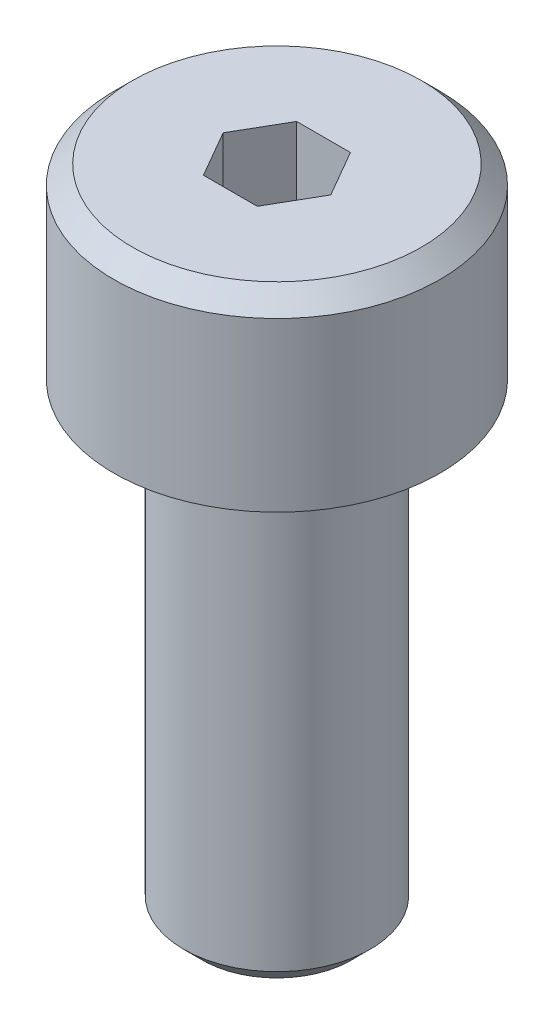
ISO-10303-21;
HEADER;
FILE_DESCRIPTION(('STEP AP214'),'2;1');
FILE_NAME('part.step','',(''),(''),'','','');
FILE_SCHEMA(('AUTOMOTIVE_DESIGN { 1 0 10303 214 1 1 1 1 }'));
ENDSEC;
DATA;
#1=APPLICATION_CONTEXT('core data for automotive mechanical design processes');
#2=APPLICATION_PROTOCOL_DEFINITION('international standard','automotive_design',2000,#1);
#3=PRODUCT_CONTEXT('',#1,'mechanical');
#4=PRODUCT('Part','Part','',(#3));
#5=PRODUCT_RELATED_PRODUCT_CATEGORY('part','',(#4));
#6=PRODUCT_DEFINITION_FORMATION('','',#4);
#7=PRODUCT_DEFINITION_CONTEXT('part definition',#1,'design');
#8=PRODUCT_DEFINITION('design','',#6,#7);
#9=PRODUCT_DEFINITION_SHAPE('','',#8);
#10=(LENGTH_UNIT() NAMED_UNIT(*) SI_UNIT(.MILLI.,.METRE.));
#11=(NAMED_UNIT(*) PLANE_ANGLE_UNIT() SI_UNIT($,.RADIAN.));
#12=(NAMED_UNIT(*) SI_UNIT($,.STERADIAN.) SOLID_ANGLE_UNIT());
#13=UNCERTAINTY_MEASURE_WITH_UNIT(LENGTH_MEASURE(1.E-05),#10,'distance_accuracy_value','');
#14=(GEOMETRIC_REPRESENTATION_CONTEXT(3) GLOBAL_UNCERTAINTY_ASSIGNED_CONTEXT((#13)) GLOBAL_UNIT_ASSIGNED_CONTEXT((#10,
#11,#12)) REPRESENTATION_CONTEXT('',''));
#15=CARTESIAN_POINT('',(0.,0.,0.));
#16=DIRECTION('',(0.,0.,1.));
#17=DIRECTION('',(1.,0.,0.));
#18=AXIS2_PLACEMENT_3D('',#15,#16,#17);
#19=CARTESIAN_POINT('',(0.,14.,0.));
#20=DIRECTION('',(0.,1.,0.));
#21=DIRECTION('',(0.,0.,1.));
#22=AXIS2_PLACEMENT_3D('',#19,#20,#21);
#23=PLANE('',#22);
#24=DIRECTION('',(0.499999999999999,0.,-0.866025403784439));
#25=VECTOR('',#24,1.);
#26=CARTESIAN_POINT('',(0.577350269189626,14.,1.));
#27=LINE('',#26,#25);
#28=CARTESIAN_POINT('',(0.577350269189626,14.,1.));
#29=VERTEX_POINT('',#28);
#30=CARTESIAN_POINT('',(1.15470053837925,14.,0.));
#31=VERTEX_POINT('',#30);
#32=EDGE_CURVE('E54',#29,#31,#27,.T.);
#33=ORIENTED_EDGE('',*,*,#32,.F.);
#34=DIRECTION('',(1.,0.,0.));
#35=VECTOR('',#34,1.);
#36=CARTESIAN_POINT('',(-0.577350269189626,14.,1.));
#37=LINE('',#36,#35);
#38=CARTESIAN_POINT('',(-0.577350269189626,14.,1.));
#39=VERTEX_POINT('',#38);
#40=EDGE_CURVE('E147',#39,#29,#37,.T.);
#41=ORIENTED_EDGE('',*,*,#40,.F.);
#42=DIRECTION('',(0.5,0.,0.866025403784439));
#43=VECTOR('',#42,1.);
#44=CARTESIAN_POINT('',(-1.15470053837925,14.,0.));
#45=LINE('',#44,#43);
#46=CARTESIAN_POINT('',(-1.15470053837925,14.,0.));
#47=VERTEX_POINT('',#46);
#48=EDGE_CURVE('E144',#47,#39,#45,.T.);
#49=ORIENTED_EDGE('',*,*,#48,.F.);
#50=DIRECTION('',(-0.5,0.,0.866025403784439));
#51=VECTOR('',#50,1.);
#52=CARTESIAN_POINT('',(-0.577350269189626,14.,-1.));
#53=LINE('',#52,#51);
#54=CARTESIAN_POINT('',(-0.577350269189626,14.,-1.));
#55=VERTEX_POINT('',#54);
#56=EDGE_CURVE('E102',#55,#47,#53,.T.);
#57=ORIENTED_EDGE('',*,*,#56,.F.);
#58=DIRECTION('',(-1.,0.,0.));
#59=VECTOR('',#58,1.);
#60=CARTESIAN_POINT('',(0.577350269189625,14.,-1.));
#61=LINE('',#60,#59);
#62=CARTESIAN_POINT('',(0.577350269189625,14.,-1.));
#63=VERTEX_POINT('',#62);
#64=EDGE_CURVE('E138',#63,#55,#61,.T.);
#65=ORIENTED_EDGE('',*,*,#64,.F.);
#66=DIRECTION('',(-0.5,0.,-0.866025403784438));
#67=VECTOR('',#66,1.);
#68=CARTESIAN_POINT('',(1.15470053837925,14.,0.));
#69=LINE('',#68,#67);
#70=EDGE_CURVE('E134',#31,#63,#69,.T.);
#71=ORIENTED_EDGE('',*,*,#70,.F.);
#72=EDGE_LOOP('',(#33,#41,#49,#57,#65,#71));
#73=FACE_BOUND('',#72,.T.);
#74=CARTESIAN_POINT('',(0.,14.,0.));
#75=DIRECTION('',(0.,1.,0.));
#76=DIRECTION('',(0.,0.,1.));
#77=AXIS2_PLACEMENT_3D('',#74,#75,#76);
#78=CIRCLE('',#77,3.1);
#79=CARTESIAN_POINT('',(0.,14.,-3.1));
#80=VERTEX_POINT('',#79);
#81=EDGE_CURVE('E174',#80,#80,#78,.T.);
#82=ORIENTED_EDGE('',*,*,#81,.T.);
#83=EDGE_LOOP('',(#82));
#84=FACE_BOUND('',#83,.T.);
#85=ADVANCED_FACE('F38',(#73,#84),#23,.T.);
#86=CARTESIAN_POINT('',(0.,0.,0.));
#87=DIRECTION('',(0.,-1.,0.));
#88=DIRECTION('',(0.,0.,-1.));
#89=AXIS2_PLACEMENT_3D('',#86,#87,#88);
#90=CYLINDRICAL_SURFACE('',#89,3.5);
#91=CARTESIAN_POINT('',(0.,13.6,0.));
#92=DIRECTION('',(0.,1.,0.));
#93=DIRECTION('',(0.,0.,1.));
#94=AXIS2_PLACEMENT_3D('',#91,#92,#93);
#95=CIRCLE('',#94,3.5);
#96=CARTESIAN_POINT('',(0.,13.6,-3.5));
#97=VERTEX_POINT('',#96);
#98=EDGE_CURVE('E170',#97,#97,#95,.F.);
#99=ORIENTED_EDGE('',*,*,#98,.T.);
#100=EDGE_LOOP('',(#99));
#101=FACE_BOUND('',#100,.T.);
#102=CARTESIAN_POINT('',(0.,10.,0.));
#103=DIRECTION('',(0.,-1.,0.));
#104=DIRECTION('',(0.,0.,-1.));
#105=AXIS2_PLACEMENT_3D('',#102,#103,#104);
#106=CIRCLE('',#105,3.5);
#107=CARTESIAN_POINT('',(0.,10.,-3.5));
#108=VERTEX_POINT('',#107);
#109=EDGE_CURVE('E166',#108,#108,#106,.T.);
#110=ORIENTED_EDGE('',*,*,#109,.F.);
#111=EDGE_LOOP('',(#110));
#112=FACE_BOUND('',#111,.T.);
#113=ADVANCED_FACE('F196',(#101,#112),#90,.T.);
#114=CARTESIAN_POINT('',(3.5,10.,0.));
#115=DIRECTION('',(0.,-1.,0.));
#116=DIRECTION('',(0.,0.,-1.));
#117=AXIS2_PLACEMENT_3D('',#114,#115,#116);
#118=PLANE('',#117);
#119=ORIENTED_EDGE('',*,*,#109,.T.);
#120=EDGE_LOOP('',(#119));
#121=FACE_BOUND('',#120,.T.);
#122=CARTESIAN_POINT('',(0.,10.,0.));
#123=DIRECTION('',(0.,-1.,0.));
#124=DIRECTION('',(0.,0.,-1.));
#125=AXIS2_PLACEMENT_3D('',#122,#123,#124);
#126=CIRCLE('',#125,2.);
#127=CARTESIAN_POINT('',(0.,10.,-2.));
#128=VERTEX_POINT('',#127);
#129=EDGE_CURVE('E153',#128,#128,#126,.T.);
#130=ORIENTED_EDGE('',*,*,#129,.F.);
#131=EDGE_LOOP('',(#130));
#132=FACE_BOUND('',#131,.T.);
#133=ADVANCED_FACE('F202',(#121,#132),#118,.T.);
#134=CARTESIAN_POINT('',(0.,0.,0.));
#135=DIRECTION('',(0.,-1.,0.));
#136=DIRECTION('',(0.,0.,-1.));
#137=AXIS2_PLACEMENT_3D('',#134,#135,#136);
#138=CYLINDRICAL_SURFACE('',#137,2.);
#139=CARTESIAN_POINT('',(0.,0.400000000000003,0.));
#140=DIRECTION('',(0.,-1.,0.));
#141=DIRECTION('',(0.,0.,-1.));
#142=AXIS2_PLACEMENT_3D('',#139,#140,#141);
#143=CIRCLE('',#142,2.);
#144=CARTESIAN_POINT('',(0.,0.400000000000003,-2.));
#145=VERTEX_POINT('',#144);
#146=EDGE_CURVE('E11',#145,#145,#143,.F.);
#147=ORIENTED_EDGE('',*,*,#146,.T.);
#148=EDGE_LOOP('',(#147));
#149=FACE_BOUND('',#148,.T.);
#150=ORIENTED_EDGE('',*,*,#129,.T.);
#151=EDGE_LOOP('',(#150));
#152=FACE_BOUND('',#151,.T.);
#153=ADVANCED_FACE('F209',(#149,#152),#138,.T.);
#154=CARTESIAN_POINT('',(2.,0.,0.));
#155=DIRECTION('',(0.,-1.,0.));
#156=DIRECTION('',(0.,0.,-1.));
#157=AXIS2_PLACEMENT_3D('',#154,#155,#156);
#158=PLANE('',#157);
#159=CARTESIAN_POINT('',(0.,0.,0.));
#160=DIRECTION('',(0.,-1.,0.));
#161=DIRECTION('',(0.,0.,-1.));
#162=AXIS2_PLACEMENT_3D('',#159,#160,#161);
#163=CIRCLE('',#162,1.6);
#164=CARTESIAN_POINT('',(0.,0.,-1.6));
#165=VERTEX_POINT('',#164);
#166=EDGE_CURVE('E47',#165,#165,#163,.T.);
#167=ORIENTED_EDGE('',*,*,#166,.T.);
#168=EDGE_LOOP('',(#167));
#169=FACE_BOUND('',#168,.T.);
#170=ADVANCED_FACE('F181',(#169),#158,.T.);
#171=CARTESIAN_POINT('',(0.,13.6,0.));
#172=DIRECTION('',(0.,-1.,0.));
#173=DIRECTION('',(0.,0.,-1.));
#174=AXIS2_PLACEMENT_3D('',#171,#172,#173);
#175=CONICAL_SURFACE('',#174,3.5,0.785398163397449);
#176=CARTESIAN_POINT('',(0.,14.,-3.1));
#177=CARTESIAN_POINT('',(0.,13.9958333333333,-3.10416666666667));
#178=CARTESIAN_POINT('',(0.,13.9916666666667,-3.10833333333333));
#179=CARTESIAN_POINT('',(0.,13.9833333333333,-3.11666666666667));
#180=CARTESIAN_POINT('',(0.,13.9791666666667,-3.12083333333333));
#181=CARTESIAN_POINT('',(0.,13.9708333333333,-3.12916666666667));
#182=CARTESIAN_POINT('',(0.,13.9666666666667,-3.13333333333333));
#183=CARTESIAN_POINT('',(0.,13.9583333333333,-3.14166666666667));
#184=CARTESIAN_POINT('',(0.,13.9541666666667,-3.14583333333333));
#185=CARTESIAN_POINT('',(0.,13.9458333333333,-3.15416666666667));
#186=CARTESIAN_POINT('',(0.,13.9416666666667,-3.15833333333333));
#187=CARTESIAN_POINT('',(0.,13.9333333333333,-3.16666666666667));
#188=CARTESIAN_POINT('',(0.,13.9291666666667,-3.17083333333334));
#189=CARTESIAN_POINT('',(0.,13.9208333333333,-3.17916666666667));
#190=CARTESIAN_POINT('',(0.,13.9166666666667,-3.18333333333333));
#191=CARTESIAN_POINT('',(0.,13.9083333333333,-3.19166666666667));
#192=CARTESIAN_POINT('',(0.,13.9041666666667,-3.19583333333333));
#193=CARTESIAN_POINT('',(0.,13.8958333333333,-3.20416666666667));
#194=CARTESIAN_POINT('',(0.,13.8916666666667,-3.20833333333333));
#195=CARTESIAN_POINT('',(0.,13.8833333333333,-3.21666666666667));
#196=CARTESIAN_POINT('',(0.,13.8791666666667,-3.22083333333333));
#197=CARTESIAN_POINT('',(0.,13.8708333333333,-3.22916666666667));
#198=CARTESIAN_POINT('',(0.,13.8666666666667,-3.23333333333334));
#199=CARTESIAN_POINT('',(0.,13.8583333333333,-3.24166666666667));
#200=CARTESIAN_POINT('',(0.,13.8541666666667,-3.24583333333333));
#201=CARTESIAN_POINT('',(0.,13.8458333333333,-3.25416666666667));
#202=CARTESIAN_POINT('',(0.,13.8416666666667,-3.25833333333334));
#203=CARTESIAN_POINT('',(0.,13.8333333333333,-3.26666666666667));
#204=CARTESIAN_POINT('',(0.,13.8291666666667,-3.27083333333333));
#205=CARTESIAN_POINT('',(0.,13.8208333333333,-3.27916666666667));
#206=CARTESIAN_POINT('',(0.,13.8166666666667,-3.28333333333333));
#207=CARTESIAN_POINT('',(0.,13.8083333333333,-3.29166666666667));
#208=CARTESIAN_POINT('',(0.,13.8041666666667,-3.29583333333333));
#209=CARTESIAN_POINT('',(0.,13.7958333333333,-3.30416666666667));
#210=CARTESIAN_POINT('',(0.,13.7916666666667,-3.30833333333333));
#211=CARTESIAN_POINT('',(0.,13.7833333333333,-3.31666666666667));
#212=CARTESIAN_POINT('',(0.,13.7791666666667,-3.32083333333333));
#213=CARTESIAN_POINT('',(0.,13.7708333333333,-3.32916666666667));
#214=CARTESIAN_POINT('',(0.,13.7666666666667,-3.33333333333333));
#215=CARTESIAN_POINT('',(0.,13.7583333333333,-3.34166666666667));
#216=CARTESIAN_POINT('',(0.,13.7541666666667,-3.34583333333333));
#217=CARTESIAN_POINT('',(0.,13.7458333333333,-3.35416666666667));
#218=CARTESIAN_POINT('',(0.,13.7416666666667,-3.35833333333333));
#219=CARTESIAN_POINT('',(0.,13.7333333333333,-3.36666666666667));
#220=CARTESIAN_POINT('',(0.,13.7291666666667,-3.37083333333333));
#221=CARTESIAN_POINT('',(0.,13.7208333333333,-3.37916666666667));
#222=CARTESIAN_POINT('',(0.,13.7166666666667,-3.38333333333333));
#223=CARTESIAN_POINT('',(0.,13.7083333333333,-3.39166666666667));
#224=CARTESIAN_POINT('',(0.,13.7041666666667,-3.39583333333333));
#225=CARTESIAN_POINT('',(0.,13.6958333333333,-3.40416666666667));
#226=CARTESIAN_POINT('',(0.,13.6916666666667,-3.40833333333333));
#227=CARTESIAN_POINT('',(0.,13.6833333333333,-3.41666666666667));
#228=CARTESIAN_POINT('',(0.,13.6791666666667,-3.42083333333333));
#229=CARTESIAN_POINT('',(0.,13.6708333333333,-3.42916666666667));
#230=CARTESIAN_POINT('',(0.,13.6666666666667,-3.43333333333333));
#231=CARTESIAN_POINT('',(0.,13.6583333333333,-3.44166666666667));
#232=CARTESIAN_POINT('',(0.,13.6541666666667,-3.44583333333333));
#233=CARTESIAN_POINT('',(0.,13.6458333333333,-3.45416666666667));
#234=CARTESIAN_POINT('',(0.,13.6416666666667,-3.45833333333333));
#235=CARTESIAN_POINT('',(0.,13.6333333333333,-3.46666666666667));
#236=CARTESIAN_POINT('',(0.,13.6291666666667,-3.47083333333333));
#237=CARTESIAN_POINT('',(0.,13.6208333333333,-3.47916666666667));
#238=CARTESIAN_POINT('',(0.,13.6166666666667,-3.48333333333333));
#239=CARTESIAN_POINT('',(0.,13.6083333333333,-3.49166666666667));
#240=CARTESIAN_POINT('',(0.,13.6041666666667,-3.49583333333333));
#241=CARTESIAN_POINT('',(0.,13.6,-3.5));
#242=B_SPLINE_CURVE_WITH_KNOTS('',3,(#176,#177,#178,#179,#180,#181,#182,#183,#184,#185,#186,
#187,#188,#189,#190,#191,#192,#193,#194,#195,#196,#197,#198,#199,#200,#201,#202,#203,#204,#205,
#206,#207,#208,#209,#210,#211,#212,#213,#214,#215,#216,#217,#218,#219,#220,#221,#222,#223,#224,
#225,#226,#227,#228,#229,#230,#231,#232,#233,#234,#235,#236,#237,#238,#239,#240,#241),
.UNSPECIFIED.,.F.,.F.,(4,2,2,2,2,2,2,2,2,2,2,2,2,2,2,2,2,2,2,2,2,2,2,2,2,2,2,2,2,2,2,2,4),(0.,
0.0176776695296639,0.0353553390593278,0.0530330085889917,0.0707106781186556,0.0883883476483182,
0.106066017177982,0.123743686707646,0.14142135623731,0.159099025766974,0.176776695296637,
0.194454364826301,0.212132034355965,0.229809703885629,0.247487373415291,0.265165042944955,
0.282842712474619,0.300520382004283,0.318198051533947,0.33587572106361,0.353553390593274,
0.371231060122938,0.388908729652601,0.406586399182264,0.424264068711928,0.441941738241592,
0.459619407771256,0.47729707730092,0.494974746830583,0.512652416360247,0.530330085889911,
0.548007755419575,0.565685424949237),.UNSPECIFIED.);
#243=EDGE_CURVE('BSEAM185',#80,#97,#242,.T.);
#244=ORIENTED_EDGE('',*,*,#81,.F.);
#245=ORIENTED_EDGE('',*,*,#98,.F.);
#246=ORIENTED_EDGE('',*,*,#243,.T.);
#247=ORIENTED_EDGE('',*,*,#243,.F.);
#248=EDGE_LOOP('',(#244,#246,#245,#247));
#249=FACE_BOUND('',#248,.T.);
#250=ADVANCED_FACE('F185',(#249),#175,.T.);
#251=CARTESIAN_POINT('',(0.,0.,0.));
#252=DIRECTION('',(0.,1.,0.));
#253=DIRECTION('',(0.,0.,1.));
#254=AXIS2_PLACEMENT_3D('',#251,#252,#253);
#255=CONICAL_SURFACE('',#254,1.6,0.785398163397447);
#256=ORIENTED_EDGE('',*,*,#146,.F.);
#257=EDGE_LOOP('',(#256));
#258=FACE_BOUND('',#257,.T.);
#259=ORIENTED_EDGE('',*,*,#166,.F.);
#260=EDGE_LOOP('',(#259));
#261=FACE_BOUND('',#260,.T.);
#262=ADVANCED_FACE('F40',(#258,#261),#255,.T.);
#263=CARTESIAN_POINT('',(0.577350269189626,10.,1.));
#264=DIRECTION('',(0.866025403784439,0.,0.5));
#265=DIRECTION('',(0.499999999999999,0.,-0.866025403784439));
#266=AXIS2_PLACEMENT_3D('',#263,#264,#265);
#267=PLANE('',#266);
#268=ORIENTED_EDGE('',*,*,#32,.T.);
#269=DIRECTION('',(0.,1.,0.));
#270=VECTOR('',#269,1.);
#271=CARTESIAN_POINT('',(1.15470053837925,10.,0.));
#272=LINE('',#271,#270);
#273=CARTESIAN_POINT('',(1.15470053837925,10.,0.));
#274=VERTEX_POINT('',#273);
#275=EDGE_CURVE('E84',#274,#31,#272,.T.);
#276=ORIENTED_EDGE('',*,*,#275,.F.);
#277=DIRECTION('',(0.499999999999999,0.,-0.866025403784439));
#278=VECTOR('',#277,1.);
#279=CARTESIAN_POINT('',(0.577350269189626,10.,1.));
#280=LINE('',#279,#278);
#281=CARTESIAN_POINT('',(0.577350269189626,10.,1.));
#282=VERTEX_POINT('',#281);
#283=EDGE_CURVE('E150',#282,#274,#280,.T.);
#284=ORIENTED_EDGE('',*,*,#283,.F.);
#285=DIRECTION('',(0.,1.,0.));
#286=VECTOR('',#285,1.);
#287=CARTESIAN_POINT('',(0.577350269189626,10.,1.));
#288=LINE('',#287,#286);
#289=EDGE_CURVE('E62',#282,#29,#288,.T.);
#290=ORIENTED_EDGE('',*,*,#289,.T.);
#291=EDGE_LOOP('',(#268,#276,#284,#290));
#292=FACE_BOUND('',#291,.T.);
#293=ADVANCED_FACE('F184',(#292),#267,.F.);
#294=CARTESIAN_POINT('',(-0.577350269189626,10.,1.));
#295=DIRECTION('',(0.,0.,1.));
#296=DIRECTION('',(1.,0.,0.));
#297=AXIS2_PLACEMENT_3D('',#294,#295,#296);
#298=PLANE('',#297);
#299=ORIENTED_EDGE('',*,*,#40,.T.);
#300=ORIENTED_EDGE('',*,*,#289,.F.);
#301=DIRECTION('',(1.,0.,0.));
#302=VECTOR('',#301,1.);
#303=CARTESIAN_POINT('',(-0.577350269189626,10.,1.));
#304=LINE('',#303,#302);
#305=CARTESIAN_POINT('',(-0.577350269189626,10.,1.));
#306=VERTEX_POINT('',#305);
#307=EDGE_CURVE('E116',#306,#282,#304,.T.);
#308=ORIENTED_EDGE('',*,*,#307,.F.);
#309=DIRECTION('',(0.,1.,0.));
#310=VECTOR('',#309,1.);
#311=CARTESIAN_POINT('',(-0.577350269189626,10.,1.));
#312=LINE('',#311,#310);
#313=EDGE_CURVE('E107',#306,#39,#312,.T.);
#314=ORIENTED_EDGE('',*,*,#313,.T.);
#315=EDGE_LOOP('',(#299,#300,#308,#314));
#316=FACE_BOUND('',#315,.T.);
#317=ADVANCED_FACE('F191',(#316),#298,.F.);
#318=CARTESIAN_POINT('',(-1.15470053837925,10.,0.));
#319=DIRECTION('',(-0.866025403784439,0.,0.5));
#320=DIRECTION('',(0.5,0.,0.866025403784439));
#321=AXIS2_PLACEMENT_3D('',#318,#319,#320);
#322=PLANE('',#321);
#323=ORIENTED_EDGE('',*,*,#48,.T.);
#324=ORIENTED_EDGE('',*,*,#313,.F.);
#325=DIRECTION('',(0.5,0.,0.866025403784439));
#326=VECTOR('',#325,1.);
#327=CARTESIAN_POINT('',(-1.15470053837925,10.,0.));
#328=LINE('',#327,#326);
#329=CARTESIAN_POINT('',(-1.15470053837925,10.,0.));
#330=VERTEX_POINT('',#329);
#331=EDGE_CURVE('E111',#330,#306,#328,.T.);
#332=ORIENTED_EDGE('',*,*,#331,.F.);
#333=DIRECTION('',(0.,1.,0.));
#334=VECTOR('',#333,1.);
#335=CARTESIAN_POINT('',(-1.15470053837925,10.,0.));
#336=LINE('',#335,#334);
#337=EDGE_CURVE('E95',#330,#47,#336,.T.);
#338=ORIENTED_EDGE('',*,*,#337,.T.);
#339=EDGE_LOOP('',(#323,#324,#332,#338));
#340=FACE_BOUND('',#339,.T.);
#341=ADVANCED_FACE('F112',(#340),#322,.F.);
#342=CARTESIAN_POINT('',(-0.577350269189626,10.,-1.));
#343=DIRECTION('',(-0.866025403784439,0.,-0.5));
#344=DIRECTION('',(-0.5,0.,0.866025403784439));
#345=AXIS2_PLACEMENT_3D('',#342,#343,#344);
#346=PLANE('',#345);
#347=ORIENTED_EDGE('',*,*,#56,.T.);
#348=ORIENTED_EDGE('',*,*,#337,.F.);
#349=DIRECTION('',(-0.5,0.,0.866025403784439));
#350=VECTOR('',#349,1.);
#351=CARTESIAN_POINT('',(-0.577350269189626,10.,-1.));
#352=LINE('',#351,#350);
#353=CARTESIAN_POINT('',(-0.577350269189626,10.,-1.));
#354=VERTEX_POINT('',#353);
#355=EDGE_CURVE('E99',#354,#330,#352,.T.);
#356=ORIENTED_EDGE('',*,*,#355,.F.);
#357=DIRECTION('',(0.,1.,0.));
#358=VECTOR('',#357,1.);
#359=CARTESIAN_POINT('',(-0.577350269189626,10.,-1.));
#360=LINE('',#359,#358);
#361=EDGE_CURVE('E108',#354,#55,#360,.T.);
#362=ORIENTED_EDGE('',*,*,#361,.T.);
#363=EDGE_LOOP('',(#347,#348,#356,#362));
#364=FACE_BOUND('',#363,.T.);
#365=ADVANCED_FACE('F97',(#364),#346,.F.);
#366=CARTESIAN_POINT('',(0.577350269189625,10.,-1.));
#367=DIRECTION('',(0.,0.,-1.));
#368=DIRECTION('',(-1.,0.,0.));
#369=AXIS2_PLACEMENT_3D('',#366,#367,#368);
#370=PLANE('',#369);
#371=ORIENTED_EDGE('',*,*,#64,.T.);
#372=ORIENTED_EDGE('',*,*,#361,.F.);
#373=DIRECTION('',(-1.,0.,0.));
#374=VECTOR('',#373,1.);
#375=CARTESIAN_POINT('',(0.577350269189625,10.,-1.));
#376=LINE('',#375,#374);
#377=CARTESIAN_POINT('',(0.577350269189625,10.,-1.));
#378=VERTEX_POINT('',#377);
#379=EDGE_CURVE('E122',#378,#354,#376,.T.);
#380=ORIENTED_EDGE('',*,*,#379,.F.);
#381=DIRECTION('',(0.,1.,0.));
#382=VECTOR('',#381,1.);
#383=CARTESIAN_POINT('',(0.577350269189625,10.,-1.));
#384=LINE('',#383,#382);
#385=EDGE_CURVE('E158',#378,#63,#384,.T.);
#386=ORIENTED_EDGE('',*,*,#385,.T.);
#387=EDGE_LOOP('',(#371,#372,#380,#386));
#388=FACE_BOUND('',#387,.T.);
#389=ADVANCED_FACE('F219',(#388),#370,.F.);
#390=CARTESIAN_POINT('',(1.15470053837925,10.,0.));
#391=DIRECTION('',(0.866025403784439,0.,-0.5));
#392=DIRECTION('',(-0.5,0.,-0.866025403784438));
#393=AXIS2_PLACEMENT_3D('',#390,#391,#392);
#394=PLANE('',#393);
#395=ORIENTED_EDGE('',*,*,#70,.T.);
#396=ORIENTED_EDGE('',*,*,#385,.F.);
#397=DIRECTION('',(-0.5,0.,-0.866025403784438));
#398=VECTOR('',#397,1.);
#399=CARTESIAN_POINT('',(1.15470053837925,10.,0.));
#400=LINE('',#399,#398);
#401=EDGE_CURVE('E126',#274,#378,#400,.T.);
#402=ORIENTED_EDGE('',*,*,#401,.F.);
#403=ORIENTED_EDGE('',*,*,#275,.T.);
#404=EDGE_LOOP('',(#395,#396,#402,#403));
#405=FACE_BOUND('',#404,.T.);
#406=ADVANCED_FACE('F216',(#405),#394,.F.);
#407=CARTESIAN_POINT('',(0.,10.,0.));
#408=DIRECTION('',(0.,1.,0.));
#409=DIRECTION('',(0.,0.,1.));
#410=AXIS2_PLACEMENT_3D('',#407,#408,#409);
#411=PLANE('',#410);
#412=ORIENTED_EDGE('',*,*,#283,.T.);
#413=ORIENTED_EDGE('',*,*,#401,.T.);
#414=ORIENTED_EDGE('',*,*,#379,.T.);
#415=ORIENTED_EDGE('',*,*,#355,.T.);
#416=ORIENTED_EDGE('',*,*,#331,.T.);
#417=ORIENTED_EDGE('',*,*,#307,.T.);
#418=EDGE_LOOP('',(#412,#413,#414,#415,#416,#417));
#419=FACE_BOUND('',#418,.T.);
#420=ADVANCED_FACE('F119',(#419),#411,.T.);
#421=CLOSED_SHELL('',(#85,#113,#133,#153,#170,#250,#262,#293,#317,#341,#365,#389,#406,#420));
#422=MANIFOLD_SOLID_BREP('B2',#421);
#423=ADVANCED_BREP_SHAPE_REPRESENTATION('',(#18,#422),#14);
#424=SHAPE_DEFINITION_REPRESENTATION(#9,#423);
ENDSEC;
END-ISO-10303-21;
